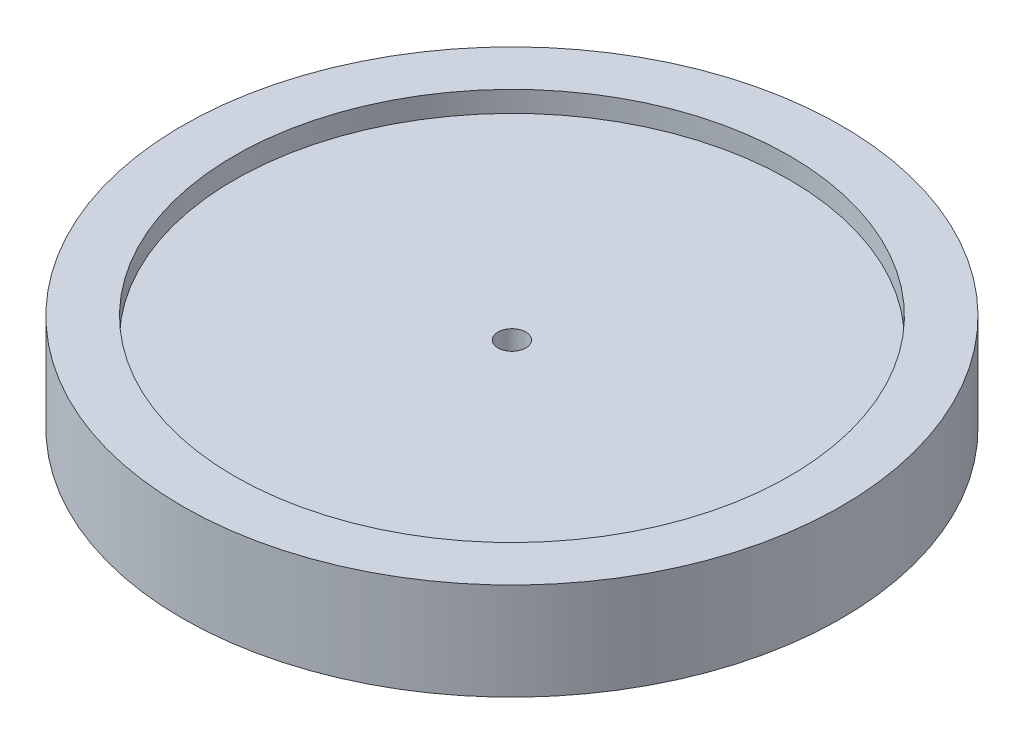
ISO-10303-21;
HEADER;
FILE_DESCRIPTION(('STEP AP214'),'2;1');
FILE_NAME('part.step','',(''),(''),'','','');
FILE_SCHEMA(('AUTOMOTIVE_DESIGN { 1 0 10303 214 1 1 1 1 }'));
ENDSEC;
DATA;
#1=APPLICATION_CONTEXT('core data for automotive mechanical design processes');
#2=APPLICATION_PROTOCOL_DEFINITION('international standard','automotive_design',2000,#1);
#3=PRODUCT_CONTEXT('',#1,'mechanical');
#4=PRODUCT('Part','Part','',(#3));
#5=PRODUCT_RELATED_PRODUCT_CATEGORY('part','',(#4));
#6=PRODUCT_DEFINITION_FORMATION('','',#4);
#7=PRODUCT_DEFINITION_CONTEXT('part definition',#1,'design');
#8=PRODUCT_DEFINITION('design','',#6,#7);
#9=PRODUCT_DEFINITION_SHAPE('','',#8);
#10=(LENGTH_UNIT() NAMED_UNIT(*) SI_UNIT(.MILLI.,.METRE.));
#11=(NAMED_UNIT(*) PLANE_ANGLE_UNIT() SI_UNIT($,.RADIAN.));
#12=(NAMED_UNIT(*) SI_UNIT($,.STERADIAN.) SOLID_ANGLE_UNIT());
#13=UNCERTAINTY_MEASURE_WITH_UNIT(LENGTH_MEASURE(1.E-05),#10,'distance_accuracy_value','');
#14=(GEOMETRIC_REPRESENTATION_CONTEXT(3) GLOBAL_UNCERTAINTY_ASSIGNED_CONTEXT((#13)) GLOBAL_UNIT_ASSIGNED_CONTEXT((#10,
#11,#12)) REPRESENTATION_CONTEXT('',''));
#15=CARTESIAN_POINT('',(0.,0.,0.));
#16=DIRECTION('',(0.,0.,1.));
#17=DIRECTION('',(1.,0.,0.));
#18=AXIS2_PLACEMENT_3D('',#15,#16,#17);
#19=CARTESIAN_POINT('',(0.,14.,0.));
#20=DIRECTION('',(0.,-1.,0.));
#21=DIRECTION('',(0.,0.,-1.));
#22=AXIS2_PLACEMENT_3D('',#19,#20,#21);
#23=CYLINDRICAL_SURFACE('',#22,2.);
#24=CARTESIAN_POINT('',(0.,-5.2,0.));
#25=DIRECTION('',(0.,-1.,0.));
#26=DIRECTION('',(0.,0.,-1.));
#27=AXIS2_PLACEMENT_3D('',#24,#25,#26);
#28=CIRCLE('',#27,2.);
#29=CARTESIAN_POINT('',(0.,-5.2,-2.));
#30=VERTEX_POINT('',#29);
#31=EDGE_CURVE('E49',#30,#30,#28,.T.);
#32=ORIENTED_EDGE('',*,*,#31,.T.);
#33=EDGE_LOOP('',(#32));
#34=FACE_BOUND('',#33,.T.);
#35=CARTESIAN_POINT('',(0.,11.,0.));
#36=DIRECTION('',(0.,1.,0.));
#37=DIRECTION('',(0.,0.,1.));
#38=AXIS2_PLACEMENT_3D('',#35,#36,#37);
#39=CIRCLE('',#38,2.);
#40=CARTESIAN_POINT('',(0.,11.,2.));
#41=VERTEX_POINT('',#40);
#42=EDGE_CURVE('E36',#41,#41,#39,.T.);
#43=ORIENTED_EDGE('',*,*,#42,.T.);
#44=EDGE_LOOP('',(#43));
#45=FACE_BOUND('',#44,.T.);
#46=ADVANCED_FACE('F32',(#34,#45),#23,.F.);
#47=CARTESIAN_POINT('',(0.,0.,0.));
#48=DIRECTION('',(0.,1.,0.));
#49=DIRECTION('',(0.,0.,1.));
#50=AXIS2_PLACEMENT_3D('',#47,#48,#49);
#51=PLANE('',#50);
#52=CARTESIAN_POINT('',(0.,0.,0.));
#53=DIRECTION('',(0.,-1.,0.));
#54=DIRECTION('',(0.,0.,-1.));
#55=AXIS2_PLACEMENT_3D('',#52,#53,#54);
#56=CIRCLE('',#55,40.);
#57=CARTESIAN_POINT('',(0.,0.,-40.));
#58=VERTEX_POINT('',#57);
#59=EDGE_CURVE('E53',#58,#58,#56,.T.);
#60=ORIENTED_EDGE('',*,*,#59,.F.);
#61=EDGE_LOOP('',(#60));
#62=FACE_BOUND('',#61,.T.);
#63=CARTESIAN_POINT('',(0.,0.,0.));
#64=DIRECTION('',(0.,1.,0.));
#65=DIRECTION('',(0.,0.,1.));
#66=AXIS2_PLACEMENT_3D('',#63,#64,#65);
#67=CIRCLE('',#66,47.5);
#68=CARTESIAN_POINT('',(0.,0.,47.5));
#69=VERTEX_POINT('',#68);
#70=EDGE_CURVE('E40',#69,#69,#67,.T.);
#71=ORIENTED_EDGE('',*,*,#70,.F.);
#72=EDGE_LOOP('',(#71));
#73=FACE_BOUND('',#72,.T.);
#74=ADVANCED_FACE('F83',(#62,#73),#51,.F.);
#75=CARTESIAN_POINT('',(0.,14.,0.));
#76=DIRECTION('',(0.,1.,0.));
#77=DIRECTION('',(0.,0.,1.));
#78=AXIS2_PLACEMENT_3D('',#75,#76,#77);
#79=PLANE('',#78);
#80=CARTESIAN_POINT('',(0.,14.,0.));
#81=DIRECTION('',(0.,1.,0.));
#82=DIRECTION('',(0.,0.,1.));
#83=AXIS2_PLACEMENT_3D('',#80,#81,#82);
#84=CIRCLE('',#83,40.);
#85=CARTESIAN_POINT('',(0.,14.,40.));
#86=VERTEX_POINT('',#85);
#87=EDGE_CURVE('E61',#86,#86,#84,.T.);
#88=ORIENTED_EDGE('',*,*,#87,.F.);
#89=EDGE_LOOP('',(#88));
#90=FACE_BOUND('',#89,.T.);
#91=CARTESIAN_POINT('',(0.,14.,0.));
#92=DIRECTION('',(0.,1.,0.));
#93=DIRECTION('',(0.,0.,1.));
#94=AXIS2_PLACEMENT_3D('',#91,#92,#93);
#95=CIRCLE('',#94,47.5);
#96=CARTESIAN_POINT('',(0.,14.,47.5));
#97=VERTEX_POINT('',#96);
#98=EDGE_CURVE('E10',#97,#97,#95,.T.);
#99=ORIENTED_EDGE('',*,*,#98,.T.);
#100=EDGE_LOOP('',(#99));
#101=FACE_BOUND('',#100,.T.);
#102=ADVANCED_FACE('F89',(#90,#101),#79,.T.);
#103=CARTESIAN_POINT('',(0.,14.,0.));
#104=DIRECTION('',(0.,-1.,0.));
#105=DIRECTION('',(0.,0.,-1.));
#106=AXIS2_PLACEMENT_3D('',#103,#104,#105);
#107=CYLINDRICAL_SURFACE('',#106,47.5);
#108=ORIENTED_EDGE('',*,*,#98,.F.);
#109=EDGE_LOOP('',(#108));
#110=FACE_BOUND('',#109,.T.);
#111=ORIENTED_EDGE('',*,*,#70,.T.);
#112=EDGE_LOOP('',(#111));
#113=FACE_BOUND('',#112,.T.);
#114=ADVANCED_FACE('F34',(#110,#113),#107,.T.);
#115=CARTESIAN_POINT('',(0.,-5.2,0.));
#116=DIRECTION('',(0.,-1.,0.));
#117=DIRECTION('',(0.,0.,-1.));
#118=AXIS2_PLACEMENT_3D('',#115,#116,#117);
#119=PLANE('',#118);
#120=CARTESIAN_POINT('',(0.,-5.2,0.));
#121=DIRECTION('',(0.,-1.,0.));
#122=DIRECTION('',(0.,0.,-1.));
#123=AXIS2_PLACEMENT_3D('',#120,#121,#122);
#124=CIRCLE('',#123,9.);
#125=CARTESIAN_POINT('',(0.,-5.2,-9.));
#126=VERTEX_POINT('',#125);
#127=EDGE_CURVE('E45',#126,#126,#124,.T.);
#128=ORIENTED_EDGE('',*,*,#127,.T.);
#129=EDGE_LOOP('',(#128));
#130=FACE_BOUND('',#129,.T.);
#131=ORIENTED_EDGE('',*,*,#31,.F.);
#132=EDGE_LOOP('',(#131));
#133=FACE_BOUND('',#132,.T.);
#134=ADVANCED_FACE('F100',(#130,#133),#119,.T.);
#135=CARTESIAN_POINT('',(0.,-5.2,0.));
#136=DIRECTION('',(0.,1.,0.));
#137=DIRECTION('',(0.,0.,1.));
#138=AXIS2_PLACEMENT_3D('',#135,#136,#137);
#139=CYLINDRICAL_SURFACE('',#138,9.);
#140=ORIENTED_EDGE('',*,*,#127,.F.);
#141=EDGE_LOOP('',(#140));
#142=FACE_BOUND('',#141,.T.);
#143=CARTESIAN_POINT('',(0.,3.,0.));
#144=DIRECTION('',(0.,-1.,0.));
#145=DIRECTION('',(0.,0.,-1.));
#146=AXIS2_PLACEMENT_3D('',#143,#144,#145);
#147=CIRCLE('',#146,9.);
#148=CARTESIAN_POINT('',(0.,3.,-9.));
#149=VERTEX_POINT('',#148);
#150=EDGE_CURVE('E56',#149,#149,#147,.T.);
#151=ORIENTED_EDGE('',*,*,#150,.T.);
#152=EDGE_LOOP('',(#151));
#153=FACE_BOUND('',#152,.T.);
#154=ADVANCED_FACE('F93',(#142,#153),#139,.T.);
#155=CARTESIAN_POINT('',(0.,3.,0.));
#156=DIRECTION('',(0.,-1.,0.));
#157=DIRECTION('',(0.,0.,-1.));
#158=AXIS2_PLACEMENT_3D('',#155,#156,#157);
#159=CYLINDRICAL_SURFACE('',#158,40.);
#160=CARTESIAN_POINT('',(0.,3.,0.));
#161=DIRECTION('',(0.,-1.,0.));
#162=DIRECTION('',(0.,0.,-1.));
#163=AXIS2_PLACEMENT_3D('',#160,#161,#162);
#164=CIRCLE('',#163,40.);
#165=CARTESIAN_POINT('',(0.,3.,-40.));
#166=VERTEX_POINT('',#165);
#167=EDGE_CURVE('E52',#166,#166,#164,.T.);
#168=ORIENTED_EDGE('',*,*,#167,.F.);
#169=EDGE_LOOP('',(#168));
#170=FACE_BOUND('',#169,.T.);
#171=ORIENTED_EDGE('',*,*,#59,.T.);
#172=EDGE_LOOP('',(#171));
#173=FACE_BOUND('',#172,.T.);
#174=ADVANCED_FACE('F114',(#170,#173),#159,.F.);
#175=CARTESIAN_POINT('',(0.,3.,0.));
#176=DIRECTION('',(0.,-1.,0.));
#177=DIRECTION('',(0.,0.,-1.));
#178=AXIS2_PLACEMENT_3D('',#175,#176,#177);
#179=PLANE('',#178);
#180=ORIENTED_EDGE('',*,*,#150,.F.);
#181=EDGE_LOOP('',(#180));
#182=FACE_BOUND('',#181,.T.);
#183=ORIENTED_EDGE('',*,*,#167,.T.);
#184=EDGE_LOOP('',(#183));
#185=FACE_BOUND('',#184,.T.);
#186=ADVANCED_FACE('F79',(#182,#185),#179,.T.);
#187=CARTESIAN_POINT('',(0.,11.,0.));
#188=DIRECTION('',(0.,1.,0.));
#189=DIRECTION('',(0.,0.,1.));
#190=AXIS2_PLACEMENT_3D('',#187,#188,#189);
#191=CYLINDRICAL_SURFACE('',#190,40.);
#192=CARTESIAN_POINT('',(0.,11.,0.));
#193=DIRECTION('',(0.,1.,0.));
#194=DIRECTION('',(0.,0.,1.));
#195=AXIS2_PLACEMENT_3D('',#192,#193,#194);
#196=CIRCLE('',#195,40.);
#197=CARTESIAN_POINT('',(0.,11.,40.));
#198=VERTEX_POINT('',#197);
#199=EDGE_CURVE('E64',#198,#198,#196,.T.);
#200=ORIENTED_EDGE('',*,*,#199,.F.);
#201=EDGE_LOOP('',(#200));
#202=FACE_BOUND('',#201,.T.);
#203=ORIENTED_EDGE('',*,*,#87,.T.);
#204=EDGE_LOOP('',(#203));
#205=FACE_BOUND('',#204,.T.);
#206=ADVANCED_FACE('F74',(#202,#205),#191,.F.);
#207=CARTESIAN_POINT('',(0.,11.,0.));
#208=DIRECTION('',(0.,1.,0.));
#209=DIRECTION('',(0.,0.,1.));
#210=AXIS2_PLACEMENT_3D('',#207,#208,#209);
#211=PLANE('',#210);
#212=ORIENTED_EDGE('',*,*,#42,.F.);
#213=EDGE_LOOP('',(#212));
#214=FACE_BOUND('',#213,.T.);
#215=ORIENTED_EDGE('',*,*,#199,.T.);
#216=EDGE_LOOP('',(#215));
#217=FACE_BOUND('',#216,.T.);
#218=ADVANCED_FACE('F72',(#214,#217),#211,.T.);
#219=CLOSED_SHELL('',(#46,#74,#102,#114,#134,#154,#174,#186,#206,#218));
#220=MANIFOLD_SOLID_BREP('B2',#219);
#221=ADVANCED_BREP_SHAPE_REPRESENTATION('',(#18,#220),#14);
#222=SHAPE_DEFINITION_REPRESENTATION(#9,#221);
ENDSEC;
END-ISO-10303-21;
